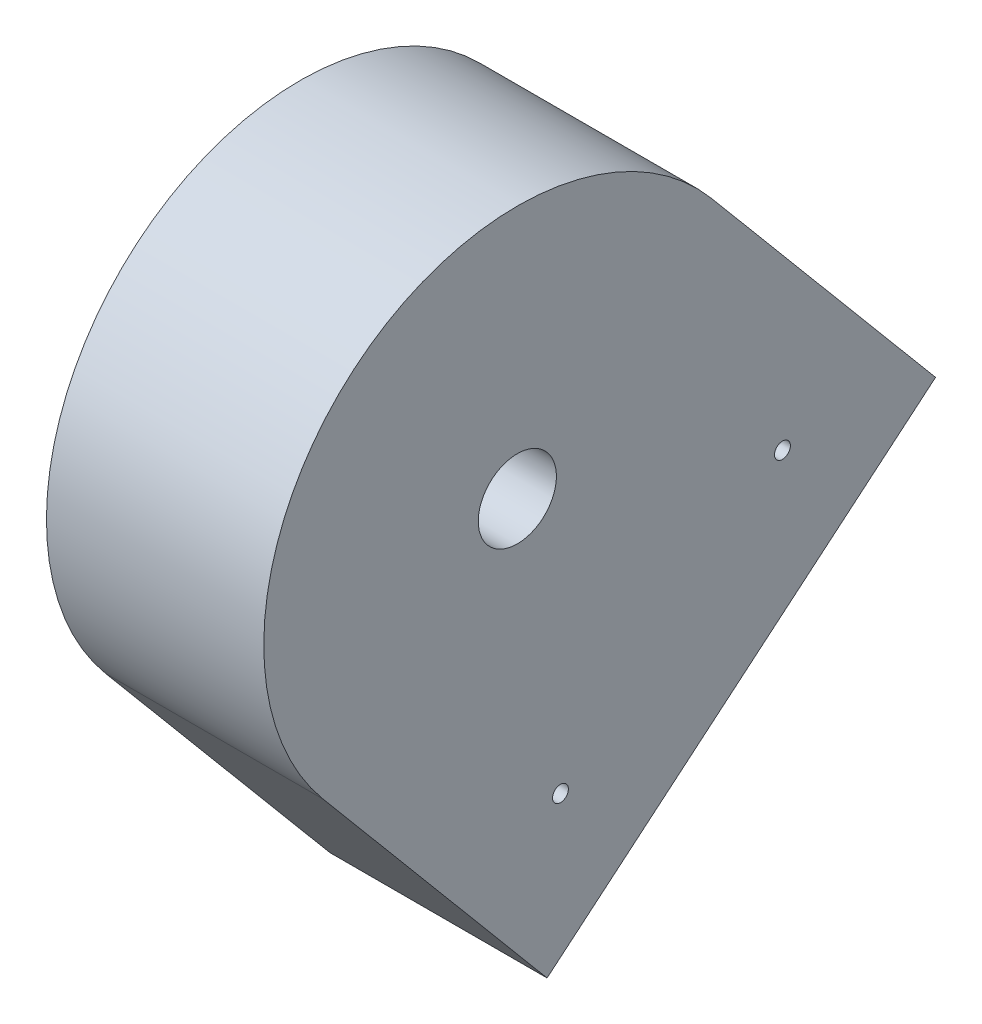
ISO-10303-21;
HEADER;
FILE_DESCRIPTION(('STEP AP214'),'2;1');
FILE_NAME('part.step','',(''),(''),'','','');
FILE_SCHEMA(('AUTOMOTIVE_DESIGN { 1 0 10303 214 1 1 1 1 }'));
ENDSEC;
DATA;
#1=APPLICATION_CONTEXT('core data for automotive mechanical design processes');
#2=APPLICATION_PROTOCOL_DEFINITION('international standard','automotive_design',2000,#1);
#3=PRODUCT_CONTEXT('',#1,'mechanical');
#4=PRODUCT('Part','Part','',(#3));
#5=PRODUCT_RELATED_PRODUCT_CATEGORY('part','',(#4));
#6=PRODUCT_DEFINITION_FORMATION('','',#4);
#7=PRODUCT_DEFINITION_CONTEXT('part definition',#1,'design');
#8=PRODUCT_DEFINITION('design','',#6,#7);
#9=PRODUCT_DEFINITION_SHAPE('','',#8);
#10=(LENGTH_UNIT() NAMED_UNIT(*) SI_UNIT(.MILLI.,.METRE.));
#11=(NAMED_UNIT(*) PLANE_ANGLE_UNIT() SI_UNIT($,.RADIAN.));
#12=(NAMED_UNIT(*) SI_UNIT($,.STERADIAN.) SOLID_ANGLE_UNIT());
#13=UNCERTAINTY_MEASURE_WITH_UNIT(LENGTH_MEASURE(1.E-05),#10,'distance_accuracy_value','');
#14=(GEOMETRIC_REPRESENTATION_CONTEXT(3) GLOBAL_UNCERTAINTY_ASSIGNED_CONTEXT((#13)) GLOBAL_UNIT_ASSIGNED_CONTEXT((#10,
#11,#12)) REPRESENTATION_CONTEXT('',''));
#15=CARTESIAN_POINT('',(0.,0.,0.));
#16=DIRECTION('',(0.,0.,1.));
#17=DIRECTION('',(1.,0.,0.));
#18=AXIS2_PLACEMENT_3D('',#15,#16,#17);
#19=CARTESIAN_POINT('',(95.3770000000001,-294.806477905682,920.738423242489));
#20=DIRECTION('',(-1.,0.,0.));
#21=DIRECTION('',(0.,-1.,0.));
#22=AXIS2_PLACEMENT_3D('',#19,#20,#21);
#23=PLANE('',#22);
#24=CARTESIAN_POINT('',(95.3770000000001,-343.335493447113,913.175089349318));
#25=DIRECTION('',(-1.,0.,0.));
#26=DIRECTION('',(0.,-1.,0.));
#27=AXIS2_PLACEMENT_3D('',#24,#25,#26);
#28=CIRCLE('',#27,1.3890625000001);
#29=CARTESIAN_POINT('',(95.3770000000001,-344.724555947113,913.175089349318));
#30=VERTEX_POINT('',#29);
#31=EDGE_CURVE('E174',#30,#30,#28,.T.);
#32=ORIENTED_EDGE('',*,*,#31,.T.);
#33=EDGE_LOOP('',(#32));
#34=FACE_BOUND('',#33,.T.);
#35=CARTESIAN_POINT('',(95.3770000000001,-310.681882875036,874.260031638874));
#36=DIRECTION('',(-1.,0.,0.));
#37=DIRECTION('',(0.,-1.,0.));
#38=AXIS2_PLACEMENT_3D('',#35,#36,#37);
#39=CIRCLE('',#38,1.3890625000001);
#40=CARTESIAN_POINT('',(95.3770000000001,-312.070945375037,874.260031638874));
#41=VERTEX_POINT('',#40);
#42=EDGE_CURVE('E166',#41,#41,#39,.T.);
#43=ORIENTED_EDGE('',*,*,#42,.T.);
#44=EDGE_LOOP('',(#43));
#45=FACE_BOUND('',#44,.T.);
#46=DIRECTION('',(0.,0.64278760968654,-0.766044443118977));
#47=VECTOR('',#46,1.);
#48=CARTESIAN_POINT('',(95.3770000000001,-313.029925551924,847.421781032929));
#49=LINE('',#48,#47);
#50=CARTESIAN_POINT('',(95.3770000000001,-370.173744053058,915.523132026206));
#51=VERTEX_POINT('',#50);
#52=CARTESIAN_POINT('',(95.3770000000001,-313.029925551924,847.421781032929));
#53=VERTEX_POINT('',#52);
#54=EDGE_CURVE('E101',#51,#53,#49,.T.);
#55=ORIENTED_EDGE('',*,*,#54,.T.);
#56=DIRECTION('',(0.,0.766044443118977,0.642787609686541));
#57=VECTOR('',#56,1.);
#58=CARTESIAN_POINT('',(95.3770000000001,-266.234568655115,886.687747745851));
#59=LINE('',#58,#57);
#60=CARTESIAN_POINT('',(95.3770000000001,-266.234568655115,886.687747745851));
#61=VERTEX_POINT('',#60);
#62=EDGE_CURVE('E96',#53,#61,#59,.T.);
#63=ORIENTED_EDGE('',*,*,#62,.T.);
#64=CARTESIAN_POINT('',(95.3770000000001,-294.806477905682,920.738423242489));
#65=DIRECTION('',(1.,0.,0.));
#66=DIRECTION('',(0.,-1.,0.));
#67=AXIS2_PLACEMENT_3D('',#64,#65,#66);
#68=CIRCLE('',#67,44.45);
#69=CARTESIAN_POINT('',(95.3770000000001,-323.378387156249,954.789098739128));
#70=VERTEX_POINT('',#69);
#71=EDGE_CURVE('E99',#61,#70,#68,.T.);
#72=ORIENTED_EDGE('',*,*,#71,.T.);
#73=DIRECTION('',(0.,-0.766044443118978,-0.64278760968654));
#74=VECTOR('',#73,1.);
#75=CARTESIAN_POINT('',(95.3770000000001,-370.173744053058,915.523132026206));
#76=LINE('',#75,#74);
#77=EDGE_CURVE('E66',#70,#51,#76,.T.);
#78=ORIENTED_EDGE('',*,*,#77,.T.);
#79=EDGE_LOOP('',(#55,#63,#72,#78));
#80=FACE_BOUND('',#79,.T.);
#81=CARTESIAN_POINT('',(95.3770000000001,-294.806477905682,920.738423242489));
#82=DIRECTION('',(1.,0.,0.));
#83=DIRECTION('',(0.,1.,0.));
#84=AXIS2_PLACEMENT_3D('',#81,#82,#83);
#85=CIRCLE('',#84,6.84999999999997);
#86=CARTESIAN_POINT('',(95.3770000000001,-301.656477905682,920.738423242489));
#87=VERTEX_POINT('',#86);
#88=EDGE_CURVE('E121',#87,#87,#85,.T.);
#89=ORIENTED_EDGE('',*,*,#88,.F.);
#90=EDGE_LOOP('',(#89));
#91=FACE_BOUND('',#90,.T.);
#92=ADVANCED_FACE('F48',(#34,#45,#80,#91),#23,.F.);
#93=CARTESIAN_POINT('',(57.2770000000001,-294.806477905682,920.738423242489));
#94=DIRECTION('',(-1.,0.,0.));
#95=DIRECTION('',(0.,-1.,0.));
#96=AXIS2_PLACEMENT_3D('',#93,#94,#95);
#97=PLANE('',#96);
#98=CARTESIAN_POINT('',(57.2770000000001,-310.681882875036,874.260031638874));
#99=DIRECTION('',(-1.,0.,0.));
#100=DIRECTION('',(0.,-1.,0.));
#101=AXIS2_PLACEMENT_3D('',#98,#99,#100);
#102=CIRCLE('',#101,1.3890625000001);
#103=CARTESIAN_POINT('',(57.2770000000001,-312.070945375037,874.260031638874));
#104=VERTEX_POINT('',#103);
#105=EDGE_CURVE('E156',#104,#104,#102,.T.);
#106=ORIENTED_EDGE('',*,*,#105,.F.);
#107=EDGE_LOOP('',(#106));
#108=FACE_BOUND('',#107,.T.);
#109=CARTESIAN_POINT('',(57.2770000000001,-343.335493447113,913.175089349318));
#110=DIRECTION('',(-1.,0.,0.));
#111=DIRECTION('',(0.,-1.,0.));
#112=AXIS2_PLACEMENT_3D('',#109,#110,#111);
#113=CIRCLE('',#112,1.3890625000001);
#114=CARTESIAN_POINT('',(57.2770000000001,-344.724555947113,913.175089349318));
#115=VERTEX_POINT('',#114);
#116=EDGE_CURVE('E147',#115,#115,#113,.T.);
#117=ORIENTED_EDGE('',*,*,#116,.F.);
#118=EDGE_LOOP('',(#117));
#119=FACE_BOUND('',#118,.T.);
#120=DIRECTION('',(0.,0.64278760968654,-0.766044443118977));
#121=VECTOR('',#120,1.);
#122=CARTESIAN_POINT('',(57.2770000000001,-313.029925551924,847.421781032929));
#123=LINE('',#122,#121);
#124=CARTESIAN_POINT('',(57.2770000000001,-370.173744053058,915.523132026206));
#125=VERTEX_POINT('',#124);
#126=CARTESIAN_POINT('',(57.2770000000001,-313.029925551924,847.421781032929));
#127=VERTEX_POINT('',#126);
#128=EDGE_CURVE('E117',#125,#127,#123,.T.);
#129=ORIENTED_EDGE('',*,*,#128,.F.);
#130=DIRECTION('',(0.,-0.766044443118978,-0.64278760968654));
#131=VECTOR('',#130,1.);
#132=CARTESIAN_POINT('',(57.2770000000001,-370.173744053058,915.523132026206));
#133=LINE('',#132,#131);
#134=CARTESIAN_POINT('',(57.2770000000001,-323.378387156249,954.789098739128));
#135=VERTEX_POINT('',#134);
#136=EDGE_CURVE('E89',#135,#125,#133,.T.);
#137=ORIENTED_EDGE('',*,*,#136,.F.);
#138=CARTESIAN_POINT('',(57.2770000000001,-294.806477905682,920.738423242489));
#139=DIRECTION('',(1.,0.,0.));
#140=DIRECTION('',(0.,-1.,0.));
#141=AXIS2_PLACEMENT_3D('',#138,#139,#140);
#142=CIRCLE('',#141,44.45);
#143=CARTESIAN_POINT('',(57.2770000000001,-266.234568655115,886.687747745851));
#144=VERTEX_POINT('',#143);
#145=EDGE_CURVE('E83',#144,#135,#142,.T.);
#146=ORIENTED_EDGE('',*,*,#145,.F.);
#147=DIRECTION('',(0.,0.766044443118977,0.642787609686541));
#148=VECTOR('',#147,1.);
#149=CARTESIAN_POINT('',(57.2770000000001,-266.234568655115,886.687747745851));
#150=LINE('',#149,#148);
#151=EDGE_CURVE('E106',#127,#144,#150,.T.);
#152=ORIENTED_EDGE('',*,*,#151,.F.);
#153=EDGE_LOOP('',(#129,#137,#146,#152));
#154=FACE_BOUND('',#153,.T.);
#155=CARTESIAN_POINT('',(57.2770000000001,-294.806477905682,920.738423242489));
#156=DIRECTION('',(1.,0.,0.));
#157=DIRECTION('',(0.,1.,0.));
#158=AXIS2_PLACEMENT_3D('',#155,#156,#157);
#159=CIRCLE('',#158,6.84999999999997);
#160=CARTESIAN_POINT('',(57.2770000000001,-301.656477905682,920.738423242489));
#161=VERTEX_POINT('',#160);
#162=EDGE_CURVE('E139',#161,#161,#159,.T.);
#163=ORIENTED_EDGE('',*,*,#162,.T.);
#164=EDGE_LOOP('',(#163));
#165=FACE_BOUND('',#164,.T.);
#166=ADVANCED_FACE('F134',(#108,#119,#154,#165),#97,.T.);
#167=CARTESIAN_POINT('',(95.3770000000001,-313.029925551924,847.421781032929));
#168=DIRECTION('',(0.,0.766044443118978,0.64278760968654));
#169=DIRECTION('',(0.,-0.64278760968654,0.766044443118977));
#170=AXIS2_PLACEMENT_3D('',#167,#168,#169);
#171=PLANE('',#170);
#172=ORIENTED_EDGE('',*,*,#128,.T.);
#173=DIRECTION('',(-1.,0.,0.));
#174=VECTOR('',#173,1.);
#175=CARTESIAN_POINT('',(95.3770000000001,-313.029925551924,847.421781032929));
#176=LINE('',#175,#174);
#177=EDGE_CURVE('E13',#53,#127,#176,.T.);
#178=ORIENTED_EDGE('',*,*,#177,.F.);
#179=ORIENTED_EDGE('',*,*,#54,.F.);
#180=DIRECTION('',(-1.,0.,0.));
#181=VECTOR('',#180,1.);
#182=CARTESIAN_POINT('',(95.3770000000001,-370.173744053058,915.523132026206));
#183=LINE('',#182,#181);
#184=EDGE_CURVE('E113',#51,#125,#183,.T.);
#185=ORIENTED_EDGE('',*,*,#184,.T.);
#186=EDGE_LOOP('',(#172,#178,#179,#185));
#187=FACE_BOUND('',#186,.T.);
#188=ADVANCED_FACE('F50',(#187),#171,.F.);
#189=CARTESIAN_POINT('',(95.3770000000001,-266.234568655115,886.687747745851));
#190=DIRECTION('',(0.,-0.642787609686541,0.766044443118977));
#191=DIRECTION('',(0.,-0.766044443118977,-0.642787609686541));
#192=AXIS2_PLACEMENT_3D('',#189,#190,#191);
#193=PLANE('',#192);
#194=ORIENTED_EDGE('',*,*,#151,.T.);
#195=DIRECTION('',(-1.,0.,0.));
#196=VECTOR('',#195,1.);
#197=CARTESIAN_POINT('',(95.3770000000001,-266.234568655115,886.687747745851));
#198=LINE('',#197,#196);
#199=EDGE_CURVE('E58',#61,#144,#198,.T.);
#200=ORIENTED_EDGE('',*,*,#199,.F.);
#201=ORIENTED_EDGE('',*,*,#62,.F.);
#202=ORIENTED_EDGE('',*,*,#177,.T.);
#203=EDGE_LOOP('',(#194,#200,#201,#202));
#204=FACE_BOUND('',#203,.T.);
#205=ADVANCED_FACE('F105',(#204),#193,.F.);
#206=CARTESIAN_POINT('',(95.3770000000001,-294.806477905682,920.738423242489));
#207=DIRECTION('',(-1.,0.,0.));
#208=DIRECTION('',(0.,-1.,0.));
#209=AXIS2_PLACEMENT_3D('',#206,#207,#208);
#210=CYLINDRICAL_SURFACE('',#209,44.45);
#211=ORIENTED_EDGE('',*,*,#145,.T.);
#212=DIRECTION('',(-1.,0.,0.));
#213=VECTOR('',#212,1.);
#214=CARTESIAN_POINT('',(95.3770000000001,-323.378387156249,954.789098739128));
#215=LINE('',#214,#213);
#216=EDGE_CURVE('E108',#70,#135,#215,.T.);
#217=ORIENTED_EDGE('',*,*,#216,.F.);
#218=ORIENTED_EDGE('',*,*,#71,.F.);
#219=ORIENTED_EDGE('',*,*,#199,.T.);
#220=EDGE_LOOP('',(#211,#217,#218,#219));
#221=FACE_BOUND('',#220,.T.);
#222=ADVANCED_FACE('F109',(#221),#210,.T.);
#223=CARTESIAN_POINT('',(95.3770000000001,-370.173744053058,915.523132026206));
#224=DIRECTION('',(0.,0.64278760968654,-0.766044443118978));
#225=DIRECTION('',(0.,0.766044443118978,0.64278760968654));
#226=AXIS2_PLACEMENT_3D('',#223,#224,#225);
#227=PLANE('',#226);
#228=ORIENTED_EDGE('',*,*,#136,.T.);
#229=ORIENTED_EDGE('',*,*,#184,.F.);
#230=ORIENTED_EDGE('',*,*,#77,.F.);
#231=ORIENTED_EDGE('',*,*,#216,.T.);
#232=EDGE_LOOP('',(#228,#229,#230,#231));
#233=FACE_BOUND('',#232,.T.);
#234=ADVANCED_FACE('F131',(#233),#227,.F.);
#235=CARTESIAN_POINT('',(95.3770000000001,-294.806477905682,920.738423242489));
#236=DIRECTION('',(-1.,0.,0.));
#237=DIRECTION('',(0.,-1.,0.));
#238=AXIS2_PLACEMENT_3D('',#235,#236,#237);
#239=CYLINDRICAL_SURFACE('',#238,6.84999999999997);
#240=CARTESIAN_POINT('',(95.3770000000001,-301.656477905682,920.738423242489));
#241=CARTESIAN_POINT('',(94.9801250000001,-301.656477905682,920.738423242489));
#242=CARTESIAN_POINT('',(94.5832500000001,-301.656477905682,920.738423242489));
#243=CARTESIAN_POINT('',(93.7895000000001,-301.656477905682,920.738423242489));
#244=CARTESIAN_POINT('',(93.3926250000001,-301.656477905682,920.738423242489));
#245=CARTESIAN_POINT('',(92.5988750000001,-301.656477905682,920.738423242489));
#246=CARTESIAN_POINT('',(92.2020000000001,-301.656477905682,920.738423242489));
#247=CARTESIAN_POINT('',(91.4082500000001,-301.656477905682,920.738423242489));
#248=CARTESIAN_POINT('',(91.0113750000001,-301.656477905682,920.738423242489));
#249=CARTESIAN_POINT('',(90.2176250000001,-301.656477905682,920.738423242489));
#250=CARTESIAN_POINT('',(89.8207500000001,-301.656477905682,920.738423242489));
#251=CARTESIAN_POINT('',(89.0270000000001,-301.656477905682,920.738423242489));
#252=CARTESIAN_POINT('',(88.6301250000001,-301.656477905682,920.738423242489));
#253=CARTESIAN_POINT('',(87.8363750000001,-301.656477905682,920.738423242489));
#254=CARTESIAN_POINT('',(87.4395000000001,-301.656477905682,920.738423242489));
#255=CARTESIAN_POINT('',(86.6457500000001,-301.656477905682,920.738423242489));
#256=CARTESIAN_POINT('',(86.2488750000001,-301.656477905682,920.738423242489));
#257=CARTESIAN_POINT('',(85.4551250000001,-301.656477905682,920.738423242489));
#258=CARTESIAN_POINT('',(85.0582500000001,-301.656477905682,920.738423242489));
#259=CARTESIAN_POINT('',(84.2645000000001,-301.656477905682,920.738423242489));
#260=CARTESIAN_POINT('',(83.8676250000001,-301.656477905682,920.738423242489));
#261=CARTESIAN_POINT('',(83.0738750000001,-301.656477905682,920.738423242489));
#262=CARTESIAN_POINT('',(82.6770000000001,-301.656477905682,920.738423242489));
#263=CARTESIAN_POINT('',(81.8832500000001,-301.656477905682,920.738423242489));
#264=CARTESIAN_POINT('',(81.4863750000001,-301.656477905682,920.738423242489));
#265=CARTESIAN_POINT('',(80.6926250000001,-301.656477905682,920.738423242489));
#266=CARTESIAN_POINT('',(80.2957500000001,-301.656477905682,920.738423242489));
#267=CARTESIAN_POINT('',(79.5020000000001,-301.656477905682,920.738423242489));
#268=CARTESIAN_POINT('',(79.1051250000001,-301.656477905682,920.738423242489));
#269=CARTESIAN_POINT('',(78.3113750000001,-301.656477905682,920.738423242489));
#270=CARTESIAN_POINT('',(77.9145000000001,-301.656477905682,920.738423242489));
#271=CARTESIAN_POINT('',(77.1207500000001,-301.656477905682,920.738423242489));
#272=CARTESIAN_POINT('',(76.7238750000001,-301.656477905682,920.738423242489));
#273=CARTESIAN_POINT('',(75.9301250000001,-301.656477905682,920.738423242489));
#274=CARTESIAN_POINT('',(75.5332500000001,-301.656477905682,920.738423242489));
#275=CARTESIAN_POINT('',(74.7395000000001,-301.656477905682,920.738423242489));
#276=CARTESIAN_POINT('',(74.3426250000001,-301.656477905682,920.738423242489));
#277=CARTESIAN_POINT('',(73.5488750000001,-301.656477905682,920.738423242489));
#278=CARTESIAN_POINT('',(73.1520000000001,-301.656477905682,920.738423242489));
#279=CARTESIAN_POINT('',(72.3582500000001,-301.656477905682,920.738423242489));
#280=CARTESIAN_POINT('',(71.9613750000001,-301.656477905682,920.738423242489));
#281=CARTESIAN_POINT('',(71.1676250000001,-301.656477905682,920.738423242489));
#282=CARTESIAN_POINT('',(70.7707500000001,-301.656477905682,920.738423242489));
#283=CARTESIAN_POINT('',(69.9770000000001,-301.656477905682,920.738423242489));
#284=CARTESIAN_POINT('',(69.5801250000001,-301.656477905682,920.738423242489));
#285=CARTESIAN_POINT('',(68.7863750000001,-301.656477905682,920.738423242489));
#286=CARTESIAN_POINT('',(68.3895000000001,-301.656477905682,920.738423242489));
#287=CARTESIAN_POINT('',(67.5957500000001,-301.656477905682,920.738423242489));
#288=CARTESIAN_POINT('',(67.1988750000001,-301.656477905682,920.738423242489));
#289=CARTESIAN_POINT('',(66.4051250000001,-301.656477905682,920.738423242489));
#290=CARTESIAN_POINT('',(66.0082500000001,-301.656477905682,920.738423242489));
#291=CARTESIAN_POINT('',(65.2145000000001,-301.656477905682,920.738423242489));
#292=CARTESIAN_POINT('',(64.8176250000001,-301.656477905682,920.738423242489));
#293=CARTESIAN_POINT('',(64.0238750000001,-301.656477905682,920.738423242489));
#294=CARTESIAN_POINT('',(63.6270000000001,-301.656477905682,920.738423242489));
#295=CARTESIAN_POINT('',(62.8332500000001,-301.656477905682,920.738423242489));
#296=CARTESIAN_POINT('',(62.4363750000001,-301.656477905682,920.738423242489));
#297=CARTESIAN_POINT('',(61.6426250000001,-301.656477905682,920.738423242489));
#298=CARTESIAN_POINT('',(61.2457500000001,-301.656477905682,920.738423242489));
#299=CARTESIAN_POINT('',(60.4520000000001,-301.656477905682,920.738423242489));
#300=CARTESIAN_POINT('',(60.0551250000001,-301.656477905682,920.738423242489));
#301=CARTESIAN_POINT('',(59.2613750000001,-301.656477905682,920.738423242489));
#302=CARTESIAN_POINT('',(58.8645000000001,-301.656477905682,920.738423242489));
#303=CARTESIAN_POINT('',(58.0707500000001,-301.656477905682,920.738423242489));
#304=CARTESIAN_POINT('',(57.6738750000001,-301.656477905682,920.738423242489));
#305=CARTESIAN_POINT('',(57.2770000000001,-301.656477905682,920.738423242489));
#306=B_SPLINE_CURVE_WITH_KNOTS('',3,(#240,#241,#242,#243,#244,#245,#246,#247,#248,#249,#250,
#251,#252,#253,#254,#255,#256,#257,#258,#259,#260,#261,#262,#263,#264,#265,#266,#267,#268,#269,
#270,#271,#272,#273,#274,#275,#276,#277,#278,#279,#280,#281,#282,#283,#284,#285,#286,#287,#288,
#289,#290,#291,#292,#293,#294,#295,#296,#297,#298,#299,#300,#301,#302,#303,#304,#305),
.UNSPECIFIED.,.F.,.F.,(4,2,2,2,2,2,2,2,2,2,2,2,2,2,2,2,2,2,2,2,2,2,2,2,2,2,2,2,2,2,2,2,4),(0.,
1.19062499999999,2.38124999999999,3.57187499999999,4.76249999999999,5.95312499999999,
7.14374999999999,8.33437499999999,9.52499999999999,10.715625,11.90625,13.096875,14.2875,
15.478125,16.66875,17.859375,19.05,20.240625,21.43125,22.621875,23.8125,25.003125,26.19375,
27.384375,28.575,29.765625,30.95625,32.146875,33.3375,34.528125,35.71875,36.909375,38.1),.UNSPECIFIED.);
#307=EDGE_CURVE('BSEAM204',#87,#161,#306,.T.);
#308=ORIENTED_EDGE('',*,*,#88,.T.);
#309=ORIENTED_EDGE('',*,*,#162,.F.);
#310=ORIENTED_EDGE('',*,*,#307,.T.);
#311=ORIENTED_EDGE('',*,*,#307,.F.);
#312=EDGE_LOOP('',(#308,#310,#309,#311));
#313=FACE_BOUND('',#312,.T.);
#314=ADVANCED_FACE('F204',(#313),#239,.F.);
#315=CARTESIAN_POINT('',(69.9770000000001,-343.335493447113,913.175089349318));
#316=DIRECTION('',(-1.,0.,0.));
#317=DIRECTION('',(0.,-1.,0.));
#318=AXIS2_PLACEMENT_3D('',#315,#316,#317);
#319=CYLINDRICAL_SURFACE('',#318,1.3890625000001);
#320=CARTESIAN_POINT('',(69.9770000000001,-343.335493447113,913.175089349318));
#321=DIRECTION('',(-1.,0.,0.));
#322=DIRECTION('',(0.,-1.,0.));
#323=AXIS2_PLACEMENT_3D('',#320,#321,#322);
#324=CIRCLE('',#323,1.3890625000001);
#325=CARTESIAN_POINT('',(69.9770000000001,-344.724555947113,913.175089349318));
#326=VERTEX_POINT('',#325);
#327=EDGE_CURVE('E151',#326,#326,#324,.T.);
#328=ORIENTED_EDGE('',*,*,#327,.F.);
#329=EDGE_LOOP('',(#328));
#330=FACE_BOUND('',#329,.T.);
#331=ORIENTED_EDGE('',*,*,#116,.T.);
#332=EDGE_LOOP('',(#331));
#333=FACE_BOUND('',#332,.T.);
#334=ADVANCED_FACE('F282',(#330,#333),#319,.F.);
#335=CARTESIAN_POINT('',(69.9770000000001,-343.335493447113,913.175089349318));
#336=DIRECTION('',(-1.,0.,0.));
#337=DIRECTION('',(0.,-1.,0.));
#338=AXIS2_PLACEMENT_3D('',#335,#336,#337);
#339=PLANE('',#338);
#340=ORIENTED_EDGE('',*,*,#327,.T.);
#341=EDGE_LOOP('',(#340));
#342=FACE_BOUND('',#341,.T.);
#343=ADVANCED_FACE('F272',(#342),#339,.T.);
#344=CARTESIAN_POINT('',(69.9770000000001,-310.681882875036,874.260031638874));
#345=DIRECTION('',(-1.,0.,0.));
#346=DIRECTION('',(0.,-1.,0.));
#347=AXIS2_PLACEMENT_3D('',#344,#345,#346);
#348=CYLINDRICAL_SURFACE('',#347,1.3890625000001);
#349=CARTESIAN_POINT('',(69.9770000000001,-310.681882875036,874.260031638874));
#350=DIRECTION('',(-1.,0.,0.));
#351=DIRECTION('',(0.,-1.,0.));
#352=AXIS2_PLACEMENT_3D('',#349,#350,#351);
#353=CIRCLE('',#352,1.3890625000001);
#354=CARTESIAN_POINT('',(69.9770000000001,-312.070945375037,874.260031638874));
#355=VERTEX_POINT('',#354);
#356=EDGE_CURVE('E143',#355,#355,#353,.T.);
#357=ORIENTED_EDGE('',*,*,#356,.F.);
#358=EDGE_LOOP('',(#357));
#359=FACE_BOUND('',#358,.T.);
#360=ORIENTED_EDGE('',*,*,#105,.T.);
#361=EDGE_LOOP('',(#360));
#362=FACE_BOUND('',#361,.T.);
#363=ADVANCED_FACE('F262',(#359,#362),#348,.F.);
#364=CARTESIAN_POINT('',(69.9770000000001,-310.681882875036,874.260031638874));
#365=DIRECTION('',(-1.,0.,0.));
#366=DIRECTION('',(0.,-1.,0.));
#367=AXIS2_PLACEMENT_3D('',#364,#365,#366);
#368=PLANE('',#367);
#369=ORIENTED_EDGE('',*,*,#356,.T.);
#370=EDGE_LOOP('',(#369));
#371=FACE_BOUND('',#370,.T.);
#372=ADVANCED_FACE('F252',(#371),#368,.T.);
#373=CARTESIAN_POINT('',(82.6770000000001,-310.681882875036,874.260031638874));
#374=DIRECTION('',(1.,0.,0.));
#375=DIRECTION('',(0.,-1.,0.));
#376=AXIS2_PLACEMENT_3D('',#373,#374,#375);
#377=CYLINDRICAL_SURFACE('',#376,1.3890625000001);
#378=CARTESIAN_POINT('',(82.6770000000001,-310.681882875036,874.260031638874));
#379=DIRECTION('',(-1.,0.,0.));
#380=DIRECTION('',(0.,-1.,0.));
#381=AXIS2_PLACEMENT_3D('',#378,#379,#380);
#382=CIRCLE('',#381,1.3890625000001);
#383=CARTESIAN_POINT('',(82.6770000000001,-312.070945375037,874.260031638874));
#384=VERTEX_POINT('',#383);
#385=EDGE_CURVE('E152',#384,#384,#382,.T.);
#386=ORIENTED_EDGE('',*,*,#385,.T.);
#387=EDGE_LOOP('',(#386));
#388=FACE_BOUND('',#387,.T.);
#389=ORIENTED_EDGE('',*,*,#42,.F.);
#390=EDGE_LOOP('',(#389));
#391=FACE_BOUND('',#390,.T.);
#392=ADVANCED_FACE('F193',(#388,#391),#377,.F.);
#393=CARTESIAN_POINT('',(82.6770000000001,-310.681882875036,874.260031638874));
#394=DIRECTION('',(1.,0.,0.));
#395=DIRECTION('',(0.,-1.,0.));
#396=AXIS2_PLACEMENT_3D('',#393,#394,#395);
#397=PLANE('',#396);
#398=ORIENTED_EDGE('',*,*,#385,.F.);
#399=EDGE_LOOP('',(#398));
#400=FACE_BOUND('',#399,.T.);
#401=ADVANCED_FACE('F184',(#400),#397,.T.);
#402=CARTESIAN_POINT('',(82.6770000000001,-343.335493447113,913.175089349318));
#403=DIRECTION('',(1.,0.,0.));
#404=DIRECTION('',(0.,-1.,0.));
#405=AXIS2_PLACEMENT_3D('',#402,#403,#404);
#406=CYLINDRICAL_SURFACE('',#405,1.3890625000001);
#407=CARTESIAN_POINT('',(82.6770000000001,-343.335493447113,913.175089349318));
#408=DIRECTION('',(-1.,0.,0.));
#409=DIRECTION('',(0.,-1.,0.));
#410=AXIS2_PLACEMENT_3D('',#407,#408,#409);
#411=CIRCLE('',#410,1.3890625000001);
#412=CARTESIAN_POINT('',(82.6770000000001,-344.724555947113,913.175089349318));
#413=VERTEX_POINT('',#412);
#414=EDGE_CURVE('E170',#413,#413,#411,.T.);
#415=ORIENTED_EDGE('',*,*,#414,.T.);
#416=EDGE_LOOP('',(#415));
#417=FACE_BOUND('',#416,.T.);
#418=ORIENTED_EDGE('',*,*,#31,.F.);
#419=EDGE_LOOP('',(#418));
#420=FACE_BOUND('',#419,.T.);
#421=ADVANCED_FACE('F181',(#417,#420),#406,.F.);
#422=CARTESIAN_POINT('',(82.6770000000001,-343.335493447113,913.175089349318));
#423=DIRECTION('',(1.,0.,0.));
#424=DIRECTION('',(0.,-1.,0.));
#425=AXIS2_PLACEMENT_3D('',#422,#423,#424);
#426=PLANE('',#425);
#427=ORIENTED_EDGE('',*,*,#414,.F.);
#428=EDGE_LOOP('',(#427));
#429=FACE_BOUND('',#428,.T.);
#430=ADVANCED_FACE('F183',(#429),#426,.T.);
#431=CLOSED_SHELL('',(#92,#166,#188,#205,#222,#234,#314,#334,#343,#363,#372,#392,#401,#421,#430));
#432=MANIFOLD_SOLID_BREP('B2',#431);
#433=ADVANCED_BREP_SHAPE_REPRESENTATION('',(#18,#432),#14);
#434=SHAPE_DEFINITION_REPRESENTATION(#9,#433);
ENDSEC;
END-ISO-10303-21;
